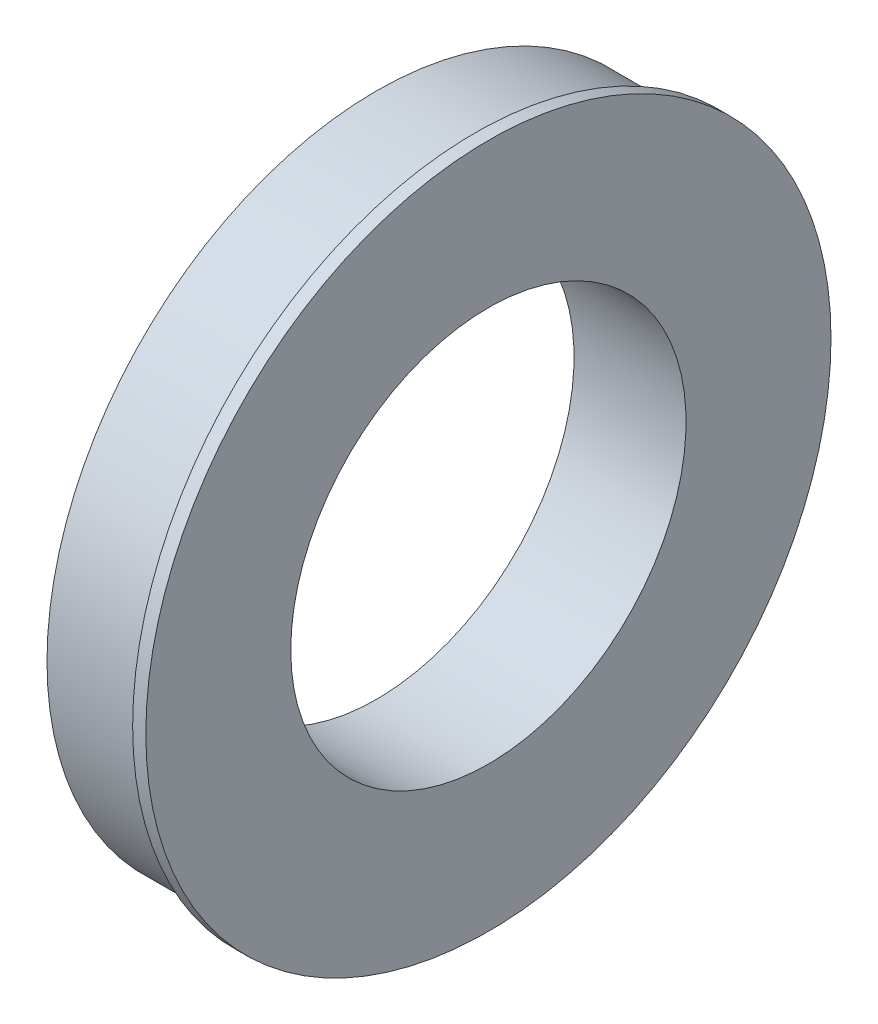
ISO-10303-21;
HEADER;
FILE_DESCRIPTION(('STEP AP214'),'2;1');
FILE_NAME('part.step','',(''),(''),'','','');
FILE_SCHEMA(('AUTOMOTIVE_DESIGN { 1 0 10303 214 1 1 1 1 }'));
ENDSEC;
DATA;
#1=APPLICATION_CONTEXT('core data for automotive mechanical design processes');
#2=APPLICATION_PROTOCOL_DEFINITION('international standard','automotive_design',2000,#1);
#3=PRODUCT_CONTEXT('',#1,'mechanical');
#4=PRODUCT('Part','Part','',(#3));
#5=PRODUCT_RELATED_PRODUCT_CATEGORY('part','',(#4));
#6=PRODUCT_DEFINITION_FORMATION('','',#4);
#7=PRODUCT_DEFINITION_CONTEXT('part definition',#1,'design');
#8=PRODUCT_DEFINITION('design','',#6,#7);
#9=PRODUCT_DEFINITION_SHAPE('','',#8);
#10=(LENGTH_UNIT() NAMED_UNIT(*) SI_UNIT(.MILLI.,.METRE.));
#11=(NAMED_UNIT(*) PLANE_ANGLE_UNIT() SI_UNIT($,.RADIAN.));
#12=(NAMED_UNIT(*) SI_UNIT($,.STERADIAN.) SOLID_ANGLE_UNIT());
#13=UNCERTAINTY_MEASURE_WITH_UNIT(LENGTH_MEASURE(1.E-05),#10,'distance_accuracy_value','');
#14=(GEOMETRIC_REPRESENTATION_CONTEXT(3) GLOBAL_UNCERTAINTY_ASSIGNED_CONTEXT((#13)) GLOBAL_UNIT_ASSIGNED_CONTEXT((#10,
#11,#12)) REPRESENTATION_CONTEXT('',''));
#15=CARTESIAN_POINT('',(0.,0.,0.));
#16=DIRECTION('',(0.,0.,1.));
#17=DIRECTION('',(1.,0.,0.));
#18=AXIS2_PLACEMENT_3D('',#15,#16,#17);
#19=CARTESIAN_POINT('',(0.,0.,0.));
#20=DIRECTION('',(1.,0.,0.));
#21=DIRECTION('',(0.,0.,-1.));
#22=AXIS2_PLACEMENT_3D('',#19,#20,#21);
#23=PLANE('',#22);
#24=CARTESIAN_POINT('',(0.,0.,0.));
#25=DIRECTION('',(1.,0.,0.));
#26=DIRECTION('',(0.,0.,-1.));
#27=AXIS2_PLACEMENT_3D('',#24,#25,#26);
#28=CIRCLE('',#27,63.5);
#29=CARTESIAN_POINT('',(0.,0.,63.5));
#30=VERTEX_POINT('',#29);
#31=EDGE_CURVE('E44',#30,#30,#28,.T.);
#32=ORIENTED_EDGE('',*,*,#31,.F.);
#33=EDGE_LOOP('',(#32));
#34=FACE_BOUND('',#33,.T.);
#35=CARTESIAN_POINT('',(0.,0.,0.));
#36=DIRECTION('',(1.,0.,0.));
#37=DIRECTION('',(0.,0.,-1.));
#38=AXIS2_PLACEMENT_3D('',#35,#36,#37);
#39=CIRCLE('',#38,38.1);
#40=CARTESIAN_POINT('',(0.,0.,38.1));
#41=VERTEX_POINT('',#40);
#42=EDGE_CURVE('E53',#41,#41,#39,.T.);
#43=ORIENTED_EDGE('',*,*,#42,.T.);
#44=EDGE_LOOP('',(#43));
#45=FACE_BOUND('',#44,.T.);
#46=ADVANCED_FACE('F40',(#34,#45),#23,.F.);
#47=CARTESIAN_POINT('',(19.05,0.,0.));
#48=DIRECTION('',(-1.,0.,0.));
#49=DIRECTION('',(0.,0.,1.));
#50=AXIS2_PLACEMENT_3D('',#47,#48,#49);
#51=CYLINDRICAL_SURFACE('',#50,63.5);
#52=CARTESIAN_POINT('',(19.05,0.,0.));
#53=DIRECTION('',(1.,0.,0.));
#54=DIRECTION('',(0.,0.,-1.));
#55=AXIS2_PLACEMENT_3D('',#52,#53,#54);
#56=CIRCLE('',#55,63.5);
#57=CARTESIAN_POINT('',(19.05,0.,63.5));
#58=VERTEX_POINT('',#57);
#59=EDGE_CURVE('E10',#58,#58,#56,.T.);
#60=CARTESIAN_POINT('',(19.05,0.,63.5));
#61=CARTESIAN_POINT('',(18.8515625,0.,63.5));
#62=CARTESIAN_POINT('',(18.653125,0.,63.5));
#63=CARTESIAN_POINT('',(18.25625,0.,63.5));
#64=CARTESIAN_POINT('',(18.0578125,0.,63.5));
#65=CARTESIAN_POINT('',(17.6609375,0.,63.5));
#66=CARTESIAN_POINT('',(17.4625,0.,63.5));
#67=CARTESIAN_POINT('',(17.065625,0.,63.5));
#68=CARTESIAN_POINT('',(16.8671875,0.,63.5));
#69=CARTESIAN_POINT('',(16.4703125,0.,63.5));
#70=CARTESIAN_POINT('',(16.271875,0.,63.5));
#71=CARTESIAN_POINT('',(15.875,0.,63.5));
#72=CARTESIAN_POINT('',(15.6765625,0.,63.5));
#73=CARTESIAN_POINT('',(15.2796875,0.,63.5));
#74=CARTESIAN_POINT('',(15.08125,0.,63.5));
#75=CARTESIAN_POINT('',(14.684375,0.,63.5));
#76=CARTESIAN_POINT('',(14.4859375,0.,63.5));
#77=CARTESIAN_POINT('',(14.0890625,0.,63.5));
#78=CARTESIAN_POINT('',(13.890625,0.,63.5));
#79=CARTESIAN_POINT('',(13.49375,0.,63.5));
#80=CARTESIAN_POINT('',(13.2953125,0.,63.5));
#81=CARTESIAN_POINT('',(12.8984375,0.,63.5));
#82=CARTESIAN_POINT('',(12.7,0.,63.5));
#83=CARTESIAN_POINT('',(12.303125,0.,63.5));
#84=CARTESIAN_POINT('',(12.1046875,0.,63.5));
#85=CARTESIAN_POINT('',(11.7078125,0.,63.5));
#86=CARTESIAN_POINT('',(11.509375,0.,63.5));
#87=CARTESIAN_POINT('',(11.1125,0.,63.5));
#88=CARTESIAN_POINT('',(10.9140625,0.,63.5));
#89=CARTESIAN_POINT('',(10.5171875,0.,63.5));
#90=CARTESIAN_POINT('',(10.31875,0.,63.5));
#91=CARTESIAN_POINT('',(9.921875,0.,63.5));
#92=CARTESIAN_POINT('',(9.7234375,0.,63.5));
#93=CARTESIAN_POINT('',(9.3265625,0.,63.5));
#94=CARTESIAN_POINT('',(9.128125,0.,63.5));
#95=CARTESIAN_POINT('',(8.73125,0.,63.5));
#96=CARTESIAN_POINT('',(8.5328125,0.,63.5));
#97=CARTESIAN_POINT('',(8.1359375,0.,63.5));
#98=CARTESIAN_POINT('',(7.9375,0.,63.5));
#99=CARTESIAN_POINT('',(7.540625,0.,63.5));
#100=CARTESIAN_POINT('',(7.3421875,0.,63.5));
#101=CARTESIAN_POINT('',(6.9453125,0.,63.5));
#102=CARTESIAN_POINT('',(6.746875,0.,63.5));
#103=CARTESIAN_POINT('',(6.35,0.,63.5));
#104=CARTESIAN_POINT('',(6.1515625,0.,63.5));
#105=CARTESIAN_POINT('',(5.7546875,0.,63.5));
#106=CARTESIAN_POINT('',(5.55625,0.,63.5));
#107=CARTESIAN_POINT('',(5.159375,0.,63.5));
#108=CARTESIAN_POINT('',(4.9609375,0.,63.5));
#109=CARTESIAN_POINT('',(4.5640625,0.,63.5));
#110=CARTESIAN_POINT('',(4.365625,0.,63.5));
#111=CARTESIAN_POINT('',(3.96875,0.,63.5));
#112=CARTESIAN_POINT('',(3.7703125,0.,63.5));
#113=CARTESIAN_POINT('',(3.3734375,0.,63.5));
#114=CARTESIAN_POINT('',(3.175,0.,63.5));
#115=CARTESIAN_POINT('',(2.778125,0.,63.5));
#116=CARTESIAN_POINT('',(2.5796875,0.,63.5));
#117=CARTESIAN_POINT('',(2.1828125,0.,63.5));
#118=CARTESIAN_POINT('',(1.984375,0.,63.5));
#119=CARTESIAN_POINT('',(1.5875,0.,63.5));
#120=CARTESIAN_POINT('',(1.3890625,0.,63.5));
#121=CARTESIAN_POINT('',(0.992187500000001,0.,63.5));
#122=CARTESIAN_POINT('',(0.793750000000001,0.,63.5));
#123=CARTESIAN_POINT('',(0.396875,0.,63.5));
#124=CARTESIAN_POINT('',(0.1984375,0.,63.5));
#125=CARTESIAN_POINT('',(0.,0.,63.5));
#126=B_SPLINE_CURVE_WITH_KNOTS('',3,(#60,#61,#62,#63,#64,#65,#66,#67,#68,#69,#70,#71,#72,#73,
#74,#75,#76,#77,#78,#79,#80,#81,#82,#83,#84,#85,#86,#87,#88,#89,#90,#91,#92,#93,#94,#95,#96,#97,
#98,#99,#100,#101,#102,#103,#104,#105,#106,#107,#108,#109,#110,#111,#112,#113,#114,#115,#116,
#117,#118,#119,#120,#121,#122,#123,#124,#125),.UNSPECIFIED.,.F.,.F.,(4,2,2,2,2,2,2,2,2,2,2,2,2,
2,2,2,2,2,2,2,2,2,2,2,2,2,2,2,2,2,2,2,4),(0.,0.5953125,1.190625,1.7859375,2.38125,2.9765625,
3.571875,4.1671875,4.7625,5.3578125,5.953125,6.5484375,7.14375,7.7390625,8.334375,8.9296875,
9.525,10.1203125,10.715625,11.3109375,11.90625,12.5015625,13.096875,13.6921875,14.2875,
14.8828125,15.478125,16.0734375,16.66875,17.2640625,17.859375,18.4546875,19.05),.UNSPECIFIED.);
#127=EDGE_CURVE('BSEAM42',#58,#30,#126,.T.);
#128=ORIENTED_EDGE('',*,*,#59,.F.);
#129=ORIENTED_EDGE('',*,*,#31,.T.);
#130=ORIENTED_EDGE('',*,*,#127,.T.);
#131=ORIENTED_EDGE('',*,*,#127,.F.);
#132=EDGE_LOOP('',(#128,#130,#129,#131));
#133=FACE_BOUND('',#132,.T.);
#134=ADVANCED_FACE('F42',(#133),#51,.T.);
#135=CARTESIAN_POINT('',(19.05,0.,0.));
#136=DIRECTION('',(-1.,0.,0.));
#137=DIRECTION('',(0.,0.,1.));
#138=AXIS2_PLACEMENT_3D('',#135,#136,#137);
#139=CYLINDRICAL_SURFACE('',#138,38.1);
#140=CARTESIAN_POINT('',(21.59,0.,0.));
#141=DIRECTION('',(1.,0.,0.));
#142=DIRECTION('',(0.,0.,-1.));
#143=AXIS2_PLACEMENT_3D('',#140,#141,#142);
#144=CIRCLE('',#143,38.1);
#145=CARTESIAN_POINT('',(21.59,0.,38.1));
#146=VERTEX_POINT('',#145);
#147=EDGE_CURVE('E63',#146,#146,#144,.T.);
#148=CARTESIAN_POINT('',(0.,0.,38.1));
#149=CARTESIAN_POINT('',(0.224895833333333,0.,38.1));
#150=CARTESIAN_POINT('',(0.449791666666667,0.,38.1));
#151=CARTESIAN_POINT('',(0.899583333333333,0.,38.1));
#152=CARTESIAN_POINT('',(1.12447916666667,0.,38.1));
#153=CARTESIAN_POINT('',(1.57427083333333,0.,38.1));
#154=CARTESIAN_POINT('',(1.79916666666667,0.,38.1));
#155=CARTESIAN_POINT('',(2.24895833333333,0.,38.1));
#156=CARTESIAN_POINT('',(2.47385416666667,0.,38.1));
#157=CARTESIAN_POINT('',(2.92364583333333,0.,38.1));
#158=CARTESIAN_POINT('',(3.14854166666667,0.,38.1));
#159=CARTESIAN_POINT('',(3.59833333333333,0.,38.1));
#160=CARTESIAN_POINT('',(3.82322916666667,0.,38.1));
#161=CARTESIAN_POINT('',(4.27302083333333,0.,38.1));
#162=CARTESIAN_POINT('',(4.49791666666667,0.,38.1));
#163=CARTESIAN_POINT('',(4.94770833333333,0.,38.1));
#164=CARTESIAN_POINT('',(5.17260416666667,0.,38.1));
#165=CARTESIAN_POINT('',(5.62239583333333,0.,38.1));
#166=CARTESIAN_POINT('',(5.84729166666667,0.,38.1));
#167=CARTESIAN_POINT('',(6.29708333333333,0.,38.1));
#168=CARTESIAN_POINT('',(6.52197916666667,0.,38.1));
#169=CARTESIAN_POINT('',(6.97177083333333,0.,38.1));
#170=CARTESIAN_POINT('',(7.19666666666667,0.,38.1));
#171=CARTESIAN_POINT('',(7.64645833333333,0.,38.1));
#172=CARTESIAN_POINT('',(7.87135416666667,0.,38.1));
#173=CARTESIAN_POINT('',(8.32114583333333,0.,38.1));
#174=CARTESIAN_POINT('',(8.54604166666667,0.,38.1));
#175=CARTESIAN_POINT('',(8.99583333333334,0.,38.1));
#176=CARTESIAN_POINT('',(9.22072916666667,0.,38.1));
#177=CARTESIAN_POINT('',(9.67052083333333,0.,38.1));
#178=CARTESIAN_POINT('',(9.89541666666667,0.,38.1));
#179=CARTESIAN_POINT('',(10.3452083333333,0.,38.1));
#180=CARTESIAN_POINT('',(10.5701041666667,0.,38.1));
#181=CARTESIAN_POINT('',(11.0198958333333,0.,38.1));
#182=CARTESIAN_POINT('',(11.2447916666667,0.,38.1));
#183=CARTESIAN_POINT('',(11.6945833333333,0.,38.1));
#184=CARTESIAN_POINT('',(11.9194791666667,0.,38.1));
#185=CARTESIAN_POINT('',(12.3692708333333,0.,38.1));
#186=CARTESIAN_POINT('',(12.5941666666667,0.,38.1));
#187=CARTESIAN_POINT('',(13.0439583333333,0.,38.1));
#188=CARTESIAN_POINT('',(13.2688541666667,0.,38.1));
#189=CARTESIAN_POINT('',(13.7186458333333,0.,38.1));
#190=CARTESIAN_POINT('',(13.9435416666667,0.,38.1));
#191=CARTESIAN_POINT('',(14.3933333333333,0.,38.1));
#192=CARTESIAN_POINT('',(14.6182291666667,0.,38.1));
#193=CARTESIAN_POINT('',(15.0680208333333,0.,38.1));
#194=CARTESIAN_POINT('',(15.2929166666667,0.,38.1));
#195=CARTESIAN_POINT('',(15.7427083333333,0.,38.1));
#196=CARTESIAN_POINT('',(15.9676041666667,0.,38.1));
#197=CARTESIAN_POINT('',(16.4173958333333,0.,38.1));
#198=CARTESIAN_POINT('',(16.6422916666667,0.,38.1));
#199=CARTESIAN_POINT('',(17.0920833333333,0.,38.1));
#200=CARTESIAN_POINT('',(17.3169791666667,0.,38.1));
#201=CARTESIAN_POINT('',(17.7667708333333,0.,38.1));
#202=CARTESIAN_POINT('',(17.9916666666667,0.,38.1));
#203=CARTESIAN_POINT('',(18.4414583333333,0.,38.1));
#204=CARTESIAN_POINT('',(18.6663541666667,0.,38.1));
#205=CARTESIAN_POINT('',(19.1161458333333,0.,38.1));
#206=CARTESIAN_POINT('',(19.3410416666667,0.,38.1));
#207=CARTESIAN_POINT('',(19.7908333333333,0.,38.1));
#208=CARTESIAN_POINT('',(20.0157291666667,0.,38.1));
#209=CARTESIAN_POINT('',(20.4655208333333,0.,38.1));
#210=CARTESIAN_POINT('',(20.6904166666667,0.,38.1));
#211=CARTESIAN_POINT('',(21.1402083333333,0.,38.1));
#212=CARTESIAN_POINT('',(21.3651041666667,0.,38.1));
#213=CARTESIAN_POINT('',(21.59,0.,38.1));
#214=B_SPLINE_CURVE_WITH_KNOTS('',3,(#148,#149,#150,#151,#152,#153,#154,#155,#156,#157,#158,
#159,#160,#161,#162,#163,#164,#165,#166,#167,#168,#169,#170,#171,#172,#173,#174,#175,#176,#177,
#178,#179,#180,#181,#182,#183,#184,#185,#186,#187,#188,#189,#190,#191,#192,#193,#194,#195,#196,
#197,#198,#199,#200,#201,#202,#203,#204,#205,#206,#207,#208,#209,#210,#211,#212,#213),
.UNSPECIFIED.,.F.,.F.,(4,2,2,2,2,2,2,2,2,2,2,2,2,2,2,2,2,2,2,2,2,2,2,2,2,2,2,2,2,2,2,2,4),(0.,
0.6746875,1.349375,2.0240625,2.69875,3.3734375,4.048125,4.7228125,5.3975,6.0721875,6.746875,
7.4215625,8.09625,8.7709375,9.445625,10.1203125,10.795,11.4696875,12.144375,12.8190625,13.49375,
14.1684375,14.843125,15.5178125,16.1925,16.8671875,17.541875,18.2165625,18.89125,19.5659375,
20.240625,20.9153125,21.59),.UNSPECIFIED.);
#215=EDGE_CURVE('BSEAM71',#41,#146,#214,.T.);
#216=ORIENTED_EDGE('',*,*,#42,.F.);
#217=ORIENTED_EDGE('',*,*,#147,.T.);
#218=ORIENTED_EDGE('',*,*,#215,.T.);
#219=ORIENTED_EDGE('',*,*,#215,.F.);
#220=EDGE_LOOP('',(#216,#218,#217,#219));
#221=FACE_BOUND('',#220,.T.);
#222=ADVANCED_FACE('F71',(#221),#139,.F.);
#223=CARTESIAN_POINT('',(21.59,0.,0.));
#224=DIRECTION('',(1.,0.,0.));
#225=DIRECTION('',(0.,0.,-1.));
#226=AXIS2_PLACEMENT_3D('',#223,#224,#225);
#227=PLANE('',#226);
#228=CARTESIAN_POINT('',(21.59,0.,0.));
#229=DIRECTION('',(1.,0.,0.));
#230=DIRECTION('',(0.,0.,-1.));
#231=AXIS2_PLACEMENT_3D('',#228,#229,#230);
#232=CIRCLE('',#231,66.04);
#233=CARTESIAN_POINT('',(21.59,0.,-66.04));
#234=VERTEX_POINT('',#233);
#235=EDGE_CURVE('E58',#234,#234,#232,.T.);
#236=ORIENTED_EDGE('',*,*,#235,.T.);
#237=EDGE_LOOP('',(#236));
#238=FACE_BOUND('',#237,.T.);
#239=ORIENTED_EDGE('',*,*,#147,.F.);
#240=EDGE_LOOP('',(#239));
#241=FACE_BOUND('',#240,.T.);
#242=ADVANCED_FACE('F73',(#238,#241),#227,.T.);
#243=CARTESIAN_POINT('',(19.05,0.,0.));
#244=DIRECTION('',(1.,0.,0.));
#245=DIRECTION('',(0.,0.,-1.));
#246=AXIS2_PLACEMENT_3D('',#243,#244,#245);
#247=PLANE('',#246);
#248=ORIENTED_EDGE('',*,*,#59,.T.);
#249=EDGE_LOOP('',(#248));
#250=FACE_BOUND('',#249,.T.);
#251=CARTESIAN_POINT('',(19.05,0.,0.));
#252=DIRECTION('',(1.,0.,0.));
#253=DIRECTION('',(0.,0.,-1.));
#254=AXIS2_PLACEMENT_3D('',#251,#252,#253);
#255=CIRCLE('',#254,66.04);
#256=CARTESIAN_POINT('',(19.05,0.,-66.04));
#257=VERTEX_POINT('',#256);
#258=EDGE_CURVE('E59',#257,#257,#255,.T.);
#259=ORIENTED_EDGE('',*,*,#258,.F.);
#260=EDGE_LOOP('',(#259));
#261=FACE_BOUND('',#260,.T.);
#262=ADVANCED_FACE('F75',(#250,#261),#247,.F.);
#263=CARTESIAN_POINT('',(21.59,0.,0.));
#264=DIRECTION('',(-1.,0.,0.));
#265=DIRECTION('',(0.,0.,1.));
#266=AXIS2_PLACEMENT_3D('',#263,#264,#265);
#267=CYLINDRICAL_SURFACE('',#266,66.04);
#268=ORIENTED_EDGE('',*,*,#235,.F.);
#269=EDGE_LOOP('',(#268));
#270=FACE_BOUND('',#269,.T.);
#271=ORIENTED_EDGE('',*,*,#258,.T.);
#272=EDGE_LOOP('',(#271));
#273=FACE_BOUND('',#272,.T.);
#274=ADVANCED_FACE('F82',(#270,#273),#267,.T.);
#275=CLOSED_SHELL('',(#46,#134,#222,#242,#262,#274));
#276=MANIFOLD_SOLID_BREP('B2',#275);
#277=ADVANCED_BREP_SHAPE_REPRESENTATION('',(#18,#276),#14);
#278=SHAPE_DEFINITION_REPRESENTATION(#9,#277);
ENDSEC;
END-ISO-10303-21;
